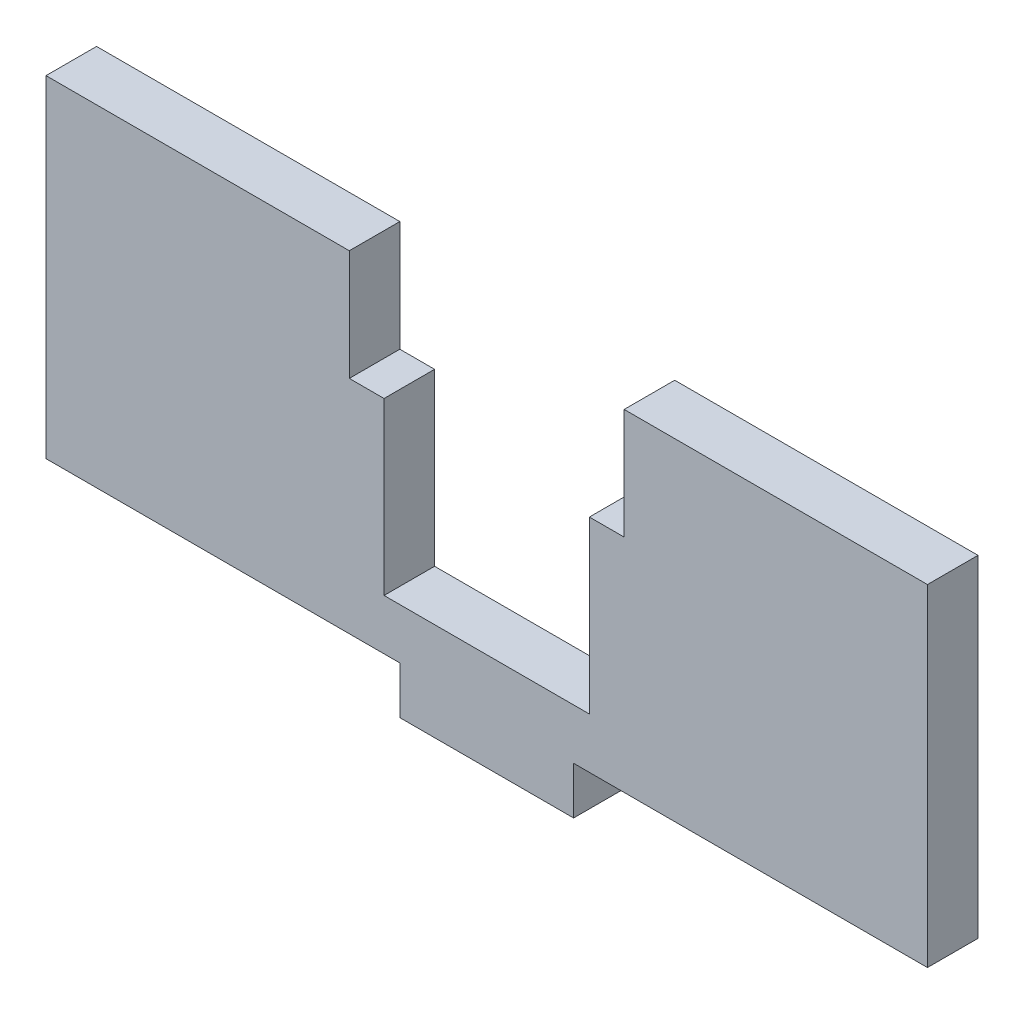
ISO-10303-21;
HEADER;
FILE_DESCRIPTION(('STEP AP214'),'2;1');
FILE_NAME('part.step','',(''),(''),'','','');
FILE_SCHEMA(('AUTOMOTIVE_DESIGN { 1 0 10303 214 1 1 1 1 }'));
ENDSEC;
DATA;
#1=APPLICATION_CONTEXT('core data for automotive mechanical design processes');
#2=APPLICATION_PROTOCOL_DEFINITION('international standard','automotive_design',2000,#1);
#3=PRODUCT_CONTEXT('',#1,'mechanical');
#4=PRODUCT('Part','Part','',(#3));
#5=PRODUCT_RELATED_PRODUCT_CATEGORY('part','',(#4));
#6=PRODUCT_DEFINITION_FORMATION('','',#4);
#7=PRODUCT_DEFINITION_CONTEXT('part definition',#1,'design');
#8=PRODUCT_DEFINITION('design','',#6,#7);
#9=PRODUCT_DEFINITION_SHAPE('','',#8);
#10=(LENGTH_UNIT() NAMED_UNIT(*) SI_UNIT(.MILLI.,.METRE.));
#11=(NAMED_UNIT(*) PLANE_ANGLE_UNIT() SI_UNIT($,.RADIAN.));
#12=(NAMED_UNIT(*) SI_UNIT($,.STERADIAN.) SOLID_ANGLE_UNIT());
#13=UNCERTAINTY_MEASURE_WITH_UNIT(LENGTH_MEASURE(1.E-05),#10,'distance_accuracy_value','');
#14=(GEOMETRIC_REPRESENTATION_CONTEXT(3) GLOBAL_UNCERTAINTY_ASSIGNED_CONTEXT((#13)) GLOBAL_UNIT_ASSIGNED_CONTEXT((#10,
#11,#12)) REPRESENTATION_CONTEXT('',''));
#15=CARTESIAN_POINT('',(0.,0.,0.));
#16=DIRECTION('',(0.,0.,1.));
#17=DIRECTION('',(1.,0.,0.));
#18=AXIS2_PLACEMENT_3D('',#15,#16,#17);
#19=CARTESIAN_POINT('',(-2.75,0.,1.6));
#20=DIRECTION('',(1.,0.,0.));
#21=DIRECTION('',(0.,0.,-1.));
#22=AXIS2_PLACEMENT_3D('',#19,#20,#21);
#23=PLANE('',#22);
#24=DIRECTION('',(0.,-1.,0.));
#25=VECTOR('',#24,1.);
#26=CARTESIAN_POINT('',(-2.75,0.,0.));
#27=LINE('',#26,#25);
#28=CARTESIAN_POINT('',(-2.75,1.5,0.));
#29=VERTEX_POINT('',#28);
#30=CARTESIAN_POINT('',(-2.75,0.,0.));
#31=VERTEX_POINT('',#30);
#32=EDGE_CURVE('E203',#29,#31,#27,.T.);
#33=ORIENTED_EDGE('',*,*,#32,.T.);
#34=DIRECTION('',(0.,0.,-1.));
#35=VECTOR('',#34,1.);
#36=CARTESIAN_POINT('',(-2.75,0.,1.6));
#37=LINE('',#36,#35);
#38=CARTESIAN_POINT('',(-2.75,0.,1.6));
#39=VERTEX_POINT('',#38);
#40=EDGE_CURVE('E40',#39,#31,#37,.T.);
#41=ORIENTED_EDGE('',*,*,#40,.F.);
#42=DIRECTION('',(0.,-1.,0.));
#43=VECTOR('',#42,1.);
#44=CARTESIAN_POINT('',(-2.75,0.,1.6));
#45=LINE('',#44,#43);
#46=CARTESIAN_POINT('',(-2.75,1.5,1.6));
#47=VERTEX_POINT('',#46);
#48=EDGE_CURVE('E204',#47,#39,#45,.T.);
#49=ORIENTED_EDGE('',*,*,#48,.F.);
#50=DIRECTION('',(0.,0.,-1.));
#51=VECTOR('',#50,1.);
#52=CARTESIAN_POINT('',(-2.75,1.5,1.6));
#53=LINE('',#52,#51);
#54=EDGE_CURVE('E227',#47,#29,#53,.T.);
#55=ORIENTED_EDGE('',*,*,#54,.T.);
#56=EDGE_LOOP('',(#33,#41,#49,#55));
#57=FACE_BOUND('',#56,.T.);
#58=ADVANCED_FACE('F33',(#57),#23,.F.);
#59=CARTESIAN_POINT('',(2.75,0.,1.6));
#60=DIRECTION('',(0.,1.,0.));
#61=DIRECTION('',(0.,0.,1.));
#62=AXIS2_PLACEMENT_3D('',#59,#60,#61);
#63=PLANE('',#62);
#64=DIRECTION('',(1.,0.,0.));
#65=VECTOR('',#64,1.);
#66=CARTESIAN_POINT('',(2.75,0.,0.));
#67=LINE('',#66,#65);
#68=CARTESIAN_POINT('',(2.75,0.,0.));
#69=VERTEX_POINT('',#68);
#70=EDGE_CURVE('E230',#31,#69,#67,.T.);
#71=ORIENTED_EDGE('',*,*,#70,.T.);
#72=DIRECTION('',(0.,0.,-1.));
#73=VECTOR('',#72,1.);
#74=CARTESIAN_POINT('',(2.75,0.,1.6));
#75=LINE('',#74,#73);
#76=CARTESIAN_POINT('',(2.75,0.,1.6));
#77=VERTEX_POINT('',#76);
#78=EDGE_CURVE('E266',#77,#69,#75,.T.);
#79=ORIENTED_EDGE('',*,*,#78,.F.);
#80=DIRECTION('',(1.,0.,0.));
#81=VECTOR('',#80,1.);
#82=CARTESIAN_POINT('',(2.75,0.,1.6));
#83=LINE('',#82,#81);
#84=EDGE_CURVE('E207',#39,#77,#83,.T.);
#85=ORIENTED_EDGE('',*,*,#84,.F.);
#86=ORIENTED_EDGE('',*,*,#40,.T.);
#87=EDGE_LOOP('',(#71,#79,#85,#86));
#88=FACE_BOUND('',#87,.T.);
#89=ADVANCED_FACE('F271',(#88),#63,.F.);
#90=CARTESIAN_POINT('',(2.75,0.,1.6));
#91=DIRECTION('',(-1.,0.,0.));
#92=DIRECTION('',(0.,0.,1.));
#93=AXIS2_PLACEMENT_3D('',#90,#91,#92);
#94=PLANE('',#93);
#95=DIRECTION('',(0.,1.,0.));
#96=VECTOR('',#95,1.);
#97=CARTESIAN_POINT('',(2.75,0.,0.));
#98=LINE('',#97,#96);
#99=CARTESIAN_POINT('',(2.75,1.5,0.));
#100=VERTEX_POINT('',#99);
#101=EDGE_CURVE('E232',#69,#100,#98,.T.);
#102=ORIENTED_EDGE('',*,*,#101,.T.);
#103=DIRECTION('',(0.,0.,-1.));
#104=VECTOR('',#103,1.);
#105=CARTESIAN_POINT('',(2.75,1.5,1.6));
#106=LINE('',#105,#104);
#107=CARTESIAN_POINT('',(2.75,1.5,1.6));
#108=VERTEX_POINT('',#107);
#109=EDGE_CURVE('E263',#108,#100,#106,.T.);
#110=ORIENTED_EDGE('',*,*,#109,.F.);
#111=DIRECTION('',(0.,1.,0.));
#112=VECTOR('',#111,1.);
#113=CARTESIAN_POINT('',(2.75,0.,1.6));
#114=LINE('',#113,#112);
#115=EDGE_CURVE('E210',#77,#108,#114,.T.);
#116=ORIENTED_EDGE('',*,*,#115,.F.);
#117=ORIENTED_EDGE('',*,*,#78,.T.);
#118=EDGE_LOOP('',(#102,#110,#116,#117));
#119=FACE_BOUND('',#118,.T.);
#120=ADVANCED_FACE('F284',(#119),#94,.F.);
#121=CARTESIAN_POINT('',(2.75,1.5,1.6));
#122=DIRECTION('',(0.,1.,0.));
#123=DIRECTION('',(-1.,0.,0.));
#124=AXIS2_PLACEMENT_3D('',#121,#122,#123);
#125=PLANE('',#124);
#126=DIRECTION('',(1.,0.,0.));
#127=VECTOR('',#126,1.);
#128=CARTESIAN_POINT('',(2.75,1.5,0.));
#129=LINE('',#128,#127);
#130=CARTESIAN_POINT('',(13.95,1.5,0.));
#131=VERTEX_POINT('',#130);
#132=EDGE_CURVE('E234',#100,#131,#129,.T.);
#133=ORIENTED_EDGE('',*,*,#132,.T.);
#134=DIRECTION('',(0.,0.,-1.));
#135=VECTOR('',#134,1.);
#136=CARTESIAN_POINT('',(13.95,1.5,1.6));
#137=LINE('',#136,#135);
#138=CARTESIAN_POINT('',(13.95,1.5,1.6));
#139=VERTEX_POINT('',#138);
#140=EDGE_CURVE('E261',#139,#131,#137,.T.);
#141=ORIENTED_EDGE('',*,*,#140,.F.);
#142=DIRECTION('',(1.,0.,0.));
#143=VECTOR('',#142,1.);
#144=CARTESIAN_POINT('',(2.75,1.5,1.6));
#145=LINE('',#144,#143);
#146=EDGE_CURVE('E154',#108,#139,#145,.T.);
#147=ORIENTED_EDGE('',*,*,#146,.F.);
#148=ORIENTED_EDGE('',*,*,#109,.T.);
#149=EDGE_LOOP('',(#133,#141,#147,#148));
#150=FACE_BOUND('',#149,.T.);
#151=ADVANCED_FACE('F287',(#150),#125,.F.);
#152=CARTESIAN_POINT('',(13.95,1.5,1.6));
#153=DIRECTION('',(-1.,0.,0.));
#154=DIRECTION('',(0.,0.,1.));
#155=AXIS2_PLACEMENT_3D('',#152,#153,#154);
#156=PLANE('',#155);
#157=DIRECTION('',(0.,1.,0.));
#158=VECTOR('',#157,1.);
#159=CARTESIAN_POINT('',(13.95,1.5,0.));
#160=LINE('',#159,#158);
#161=CARTESIAN_POINT('',(13.95,12.,0.));
#162=VERTEX_POINT('',#161);
#163=EDGE_CURVE('E164',#131,#162,#160,.T.);
#164=ORIENTED_EDGE('',*,*,#163,.T.);
#165=DIRECTION('',(0.,0.,1.));
#166=VECTOR('',#165,1.);
#167=CARTESIAN_POINT('',(13.95,12.,-9.65194280961092));
#168=LINE('',#167,#166);
#169=CARTESIAN_POINT('',(13.95,12.,1.6));
#170=VERTEX_POINT('',#169);
#171=EDGE_CURVE('E161',#162,#170,#168,.T.);
#172=ORIENTED_EDGE('',*,*,#171,.T.);
#173=DIRECTION('',(0.,1.,0.));
#174=VECTOR('',#173,1.);
#175=CARTESIAN_POINT('',(13.95,1.5,1.6));
#176=LINE('',#175,#174);
#177=EDGE_CURVE('E147',#139,#170,#176,.T.);
#178=ORIENTED_EDGE('',*,*,#177,.F.);
#179=ORIENTED_EDGE('',*,*,#140,.T.);
#180=EDGE_LOOP('',(#164,#172,#178,#179));
#181=FACE_BOUND('',#180,.T.);
#182=ADVANCED_FACE('F162',(#181),#156,.F.);
#183=CARTESIAN_POINT('',(4.35,11.,1.6));
#184=DIRECTION('',(1.,0.,0.));
#185=DIRECTION('',(0.,0.,-1.));
#186=AXIS2_PLACEMENT_3D('',#183,#184,#185);
#187=PLANE('',#186);
#188=DIRECTION('',(0.,-1.,0.));
#189=VECTOR('',#188,1.);
#190=CARTESIAN_POINT('',(4.35,11.,0.));
#191=LINE('',#190,#189);
#192=CARTESIAN_POINT('',(4.35,12.,0.));
#193=VERTEX_POINT('',#192);
#194=CARTESIAN_POINT('',(4.35,8.5,0.));
#195=VERTEX_POINT('',#194);
#196=EDGE_CURVE('E47',#193,#195,#191,.T.);
#197=ORIENTED_EDGE('',*,*,#196,.T.);
#198=DIRECTION('',(0.,0.,1.));
#199=VECTOR('',#198,1.);
#200=CARTESIAN_POINT('',(4.35,8.5,0.));
#201=LINE('',#200,#199);
#202=CARTESIAN_POINT('',(4.35,8.5,1.6));
#203=VERTEX_POINT('',#202);
#204=EDGE_CURVE('E195',#195,#203,#201,.T.);
#205=ORIENTED_EDGE('',*,*,#204,.T.);
#206=DIRECTION('',(0.,-1.,0.));
#207=VECTOR('',#206,1.);
#208=CARTESIAN_POINT('',(4.35,11.,1.6));
#209=LINE('',#208,#207);
#210=CARTESIAN_POINT('',(4.35,12.,1.6));
#211=VERTEX_POINT('',#210);
#212=EDGE_CURVE('E158',#211,#203,#209,.T.);
#213=ORIENTED_EDGE('',*,*,#212,.F.);
#214=DIRECTION('',(0.,0.,1.));
#215=VECTOR('',#214,1.);
#216=CARTESIAN_POINT('',(4.35,12.,-9.65194280961092));
#217=LINE('',#216,#215);
#218=EDGE_CURVE('E168',#193,#211,#217,.T.);
#219=ORIENTED_EDGE('',*,*,#218,.F.);
#220=EDGE_LOOP('',(#197,#205,#213,#219));
#221=FACE_BOUND('',#220,.T.);
#222=ADVANCED_FACE('F289',(#221),#187,.F.);
#223=CARTESIAN_POINT('',(3.25,9.5,1.6));
#224=DIRECTION('',(1.,0.,0.));
#225=DIRECTION('',(0.,1.,0.));
#226=AXIS2_PLACEMENT_3D('',#223,#224,#225);
#227=PLANE('',#226);
#228=DIRECTION('',(0.,-1.,0.));
#229=VECTOR('',#228,1.);
#230=CARTESIAN_POINT('',(3.25,9.5,1.6));
#231=LINE('',#230,#229);
#232=CARTESIAN_POINT('',(3.25,8.5,1.6));
#233=VERTEX_POINT('',#232);
#234=CARTESIAN_POINT('',(3.25,3.1,1.6));
#235=VERTEX_POINT('',#234);
#236=EDGE_CURVE('E214',#233,#235,#231,.T.);
#237=ORIENTED_EDGE('',*,*,#236,.F.);
#238=DIRECTION('',(0.,0.,-1.));
#239=VECTOR('',#238,1.);
#240=CARTESIAN_POINT('',(3.25,8.5,1.6));
#241=LINE('',#240,#239);
#242=CARTESIAN_POINT('',(3.25,8.5,0.));
#243=VERTEX_POINT('',#242);
#244=EDGE_CURVE('E200',#233,#243,#241,.T.);
#245=ORIENTED_EDGE('',*,*,#244,.T.);
#246=DIRECTION('',(0.,-1.,0.));
#247=VECTOR('',#246,1.);
#248=CARTESIAN_POINT('',(3.25,9.5,0.));
#249=LINE('',#248,#247);
#250=CARTESIAN_POINT('',(3.25,3.1,0.));
#251=VERTEX_POINT('',#250);
#252=EDGE_CURVE('E238',#243,#251,#249,.T.);
#253=ORIENTED_EDGE('',*,*,#252,.T.);
#254=DIRECTION('',(0.,0.,-1.));
#255=VECTOR('',#254,1.);
#256=CARTESIAN_POINT('',(3.25,3.1,1.6));
#257=LINE('',#256,#255);
#258=EDGE_CURVE('E258',#235,#251,#257,.T.);
#259=ORIENTED_EDGE('',*,*,#258,.F.);
#260=EDGE_LOOP('',(#237,#245,#253,#259));
#261=FACE_BOUND('',#260,.T.);
#262=ADVANCED_FACE('F296',(#261),#227,.F.);
#263=CARTESIAN_POINT('',(-3.25,3.1,1.6));
#264=DIRECTION('',(0.,-1.,0.));
#265=DIRECTION('',(0.,0.,-1.));
#266=AXIS2_PLACEMENT_3D('',#263,#264,#265);
#267=PLANE('',#266);
#268=DIRECTION('',(-1.,0.,0.));
#269=VECTOR('',#268,1.);
#270=CARTESIAN_POINT('',(-3.25,3.1,0.));
#271=LINE('',#270,#269);
#272=CARTESIAN_POINT('',(-3.25,3.1,0.));
#273=VERTEX_POINT('',#272);
#274=EDGE_CURVE('E240',#251,#273,#271,.T.);
#275=ORIENTED_EDGE('',*,*,#274,.T.);
#276=DIRECTION('',(0.,0.,-1.));
#277=VECTOR('',#276,1.);
#278=CARTESIAN_POINT('',(-3.25,3.1,1.6));
#279=LINE('',#278,#277);
#280=CARTESIAN_POINT('',(-3.25,3.1,1.6));
#281=VERTEX_POINT('',#280);
#282=EDGE_CURVE('E255',#281,#273,#279,.T.);
#283=ORIENTED_EDGE('',*,*,#282,.F.);
#284=DIRECTION('',(-1.,0.,0.));
#285=VECTOR('',#284,1.);
#286=CARTESIAN_POINT('',(-3.25,3.1,1.6));
#287=LINE('',#286,#285);
#288=EDGE_CURVE('E216',#235,#281,#287,.T.);
#289=ORIENTED_EDGE('',*,*,#288,.F.);
#290=ORIENTED_EDGE('',*,*,#258,.T.);
#291=EDGE_LOOP('',(#275,#283,#289,#290));
#292=FACE_BOUND('',#291,.T.);
#293=ADVANCED_FACE('F302',(#292),#267,.F.);
#294=CARTESIAN_POINT('',(-3.25,9.5,1.6));
#295=DIRECTION('',(-1.,0.,0.));
#296=DIRECTION('',(0.,-1.,0.));
#297=AXIS2_PLACEMENT_3D('',#294,#295,#296);
#298=PLANE('',#297);
#299=DIRECTION('',(0.,1.,0.));
#300=VECTOR('',#299,1.);
#301=CARTESIAN_POINT('',(-3.25,9.5,0.));
#302=LINE('',#301,#300);
#303=CARTESIAN_POINT('',(-3.25,8.5,0.));
#304=VERTEX_POINT('',#303);
#305=EDGE_CURVE('E242',#273,#304,#302,.T.);
#306=ORIENTED_EDGE('',*,*,#305,.T.);
#307=DIRECTION('',(0.,0.,1.));
#308=VECTOR('',#307,1.);
#309=CARTESIAN_POINT('',(-3.25,8.5,1.6));
#310=LINE('',#309,#308);
#311=CARTESIAN_POINT('',(-3.25,8.5,1.6));
#312=VERTEX_POINT('',#311);
#313=EDGE_CURVE('E55',#304,#312,#310,.T.);
#314=ORIENTED_EDGE('',*,*,#313,.T.);
#315=DIRECTION('',(0.,1.,0.));
#316=VECTOR('',#315,1.);
#317=CARTESIAN_POINT('',(-3.25,9.5,1.6));
#318=LINE('',#317,#316);
#319=EDGE_CURVE('E218',#281,#312,#318,.T.);
#320=ORIENTED_EDGE('',*,*,#319,.F.);
#321=ORIENTED_EDGE('',*,*,#282,.T.);
#322=EDGE_LOOP('',(#306,#314,#320,#321));
#323=FACE_BOUND('',#322,.T.);
#324=ADVANCED_FACE('F306',(#323),#298,.F.);
#325=CARTESIAN_POINT('',(-4.35,11.,1.6));
#326=DIRECTION('',(-1.,0.,0.));
#327=DIRECTION('',(0.,0.,1.));
#328=AXIS2_PLACEMENT_3D('',#325,#326,#327);
#329=PLANE('',#328);
#330=DIRECTION('',(0.,1.,0.));
#331=VECTOR('',#330,1.);
#332=CARTESIAN_POINT('',(-4.35,11.,0.));
#333=LINE('',#332,#331);
#334=CARTESIAN_POINT('',(-4.35,8.5,0.));
#335=VERTEX_POINT('',#334);
#336=CARTESIAN_POINT('',(-4.35,12.,0.));
#337=VERTEX_POINT('',#336);
#338=EDGE_CURVE('E245',#335,#337,#333,.T.);
#339=ORIENTED_EDGE('',*,*,#338,.T.);
#340=DIRECTION('',(0.,0.,1.));
#341=VECTOR('',#340,1.);
#342=CARTESIAN_POINT('',(-4.35,12.,-9.65194280961092));
#343=LINE('',#342,#341);
#344=CARTESIAN_POINT('',(-4.35,12.,1.6));
#345=VERTEX_POINT('',#344);
#346=EDGE_CURVE('E185',#337,#345,#343,.T.);
#347=ORIENTED_EDGE('',*,*,#346,.T.);
#348=DIRECTION('',(0.,1.,0.));
#349=VECTOR('',#348,1.);
#350=CARTESIAN_POINT('',(-4.35,11.,1.6));
#351=LINE('',#350,#349);
#352=CARTESIAN_POINT('',(-4.35,8.5,1.6));
#353=VERTEX_POINT('',#352);
#354=EDGE_CURVE('E221',#353,#345,#351,.T.);
#355=ORIENTED_EDGE('',*,*,#354,.F.);
#356=DIRECTION('',(0.,0.,1.));
#357=VECTOR('',#356,1.);
#358=CARTESIAN_POINT('',(-4.35,8.5,0.));
#359=LINE('',#358,#357);
#360=EDGE_CURVE('E192',#335,#353,#359,.T.);
#361=ORIENTED_EDGE('',*,*,#360,.F.);
#362=EDGE_LOOP('',(#339,#347,#355,#361));
#363=FACE_BOUND('',#362,.T.);
#364=ADVANCED_FACE('F310',(#363),#329,.F.);
#365=CARTESIAN_POINT('',(-13.95,1.5,1.6));
#366=DIRECTION('',(1.,0.,0.));
#367=DIRECTION('',(0.,0.,-1.));
#368=AXIS2_PLACEMENT_3D('',#365,#366,#367);
#369=PLANE('',#368);
#370=DIRECTION('',(0.,-1.,0.));
#371=VECTOR('',#370,1.);
#372=CARTESIAN_POINT('',(-13.95,1.5,0.));
#373=LINE('',#372,#371);
#374=CARTESIAN_POINT('',(-13.95,12.,0.));
#375=VERTEX_POINT('',#374);
#376=CARTESIAN_POINT('',(-13.95,1.5,0.));
#377=VERTEX_POINT('',#376);
#378=EDGE_CURVE('E247',#375,#377,#373,.T.);
#379=ORIENTED_EDGE('',*,*,#378,.T.);
#380=DIRECTION('',(0.,0.,-1.));
#381=VECTOR('',#380,1.);
#382=CARTESIAN_POINT('',(-13.95,1.5,1.6));
#383=LINE('',#382,#381);
#384=CARTESIAN_POINT('',(-13.95,1.5,1.6));
#385=VERTEX_POINT('',#384);
#386=EDGE_CURVE('E252',#385,#377,#383,.T.);
#387=ORIENTED_EDGE('',*,*,#386,.F.);
#388=DIRECTION('',(0.,-1.,0.));
#389=VECTOR('',#388,1.);
#390=CARTESIAN_POINT('',(-13.95,1.5,1.6));
#391=LINE('',#390,#389);
#392=CARTESIAN_POINT('',(-13.95,12.,1.6));
#393=VERTEX_POINT('',#392);
#394=EDGE_CURVE('E223',#393,#385,#391,.T.);
#395=ORIENTED_EDGE('',*,*,#394,.F.);
#396=DIRECTION('',(0.,0.,1.));
#397=VECTOR('',#396,1.);
#398=CARTESIAN_POINT('',(-13.95,12.,-9.65194280961092));
#399=LINE('',#398,#397);
#400=EDGE_CURVE('E182',#375,#393,#399,.T.);
#401=ORIENTED_EDGE('',*,*,#400,.F.);
#402=EDGE_LOOP('',(#379,#387,#395,#401));
#403=FACE_BOUND('',#402,.T.);
#404=ADVANCED_FACE('F320',(#403),#369,.F.);
#405=CARTESIAN_POINT('',(-2.75,1.5,1.6));
#406=DIRECTION('',(0.,1.,0.));
#407=DIRECTION('',(-1.,0.,0.));
#408=AXIS2_PLACEMENT_3D('',#405,#406,#407);
#409=PLANE('',#408);
#410=DIRECTION('',(1.,0.,0.));
#411=VECTOR('',#410,1.);
#412=CARTESIAN_POINT('',(-2.75,1.5,0.));
#413=LINE('',#412,#411);
#414=EDGE_CURVE('E208',#377,#29,#413,.T.);
#415=ORIENTED_EDGE('',*,*,#414,.T.);
#416=ORIENTED_EDGE('',*,*,#54,.F.);
#417=DIRECTION('',(1.,0.,0.));
#418=VECTOR('',#417,1.);
#419=CARTESIAN_POINT('',(-2.75,1.5,1.6));
#420=LINE('',#419,#418);
#421=EDGE_CURVE('E225',#385,#47,#420,.T.);
#422=ORIENTED_EDGE('',*,*,#421,.F.);
#423=ORIENTED_EDGE('',*,*,#386,.T.);
#424=EDGE_LOOP('',(#415,#416,#422,#423));
#425=FACE_BOUND('',#424,.T.);
#426=ADVANCED_FACE('F322',(#425),#409,.F.);
#427=CARTESIAN_POINT('',(0.,0.,1.6));
#428=DIRECTION('',(0.,0.,1.));
#429=DIRECTION('',(1.,0.,0.));
#430=AXIS2_PLACEMENT_3D('',#427,#428,#429);
#431=PLANE('',#430);
#432=DIRECTION('',(1.,0.,0.));
#433=VECTOR('',#432,1.);
#434=CARTESIAN_POINT('',(-4.35,8.5,1.6));
#435=LINE('',#434,#433);
#436=EDGE_CURVE('E193',#353,#312,#435,.T.);
#437=ORIENTED_EDGE('',*,*,#436,.F.);
#438=ORIENTED_EDGE('',*,*,#354,.T.);
#439=DIRECTION('',(-1.,0.,0.));
#440=VECTOR('',#439,1.);
#441=CARTESIAN_POINT('',(-13.95,12.,1.6));
#442=LINE('',#441,#440);
#443=EDGE_CURVE('E177',#345,#393,#442,.T.);
#444=ORIENTED_EDGE('',*,*,#443,.T.);
#445=ORIENTED_EDGE('',*,*,#394,.T.);
#446=ORIENTED_EDGE('',*,*,#421,.T.);
#447=ORIENTED_EDGE('',*,*,#48,.T.);
#448=ORIENTED_EDGE('',*,*,#84,.T.);
#449=ORIENTED_EDGE('',*,*,#115,.T.);
#450=ORIENTED_EDGE('',*,*,#146,.T.);
#451=ORIENTED_EDGE('',*,*,#177,.T.);
#452=DIRECTION('',(-1.,0.,0.));
#453=VECTOR('',#452,1.);
#454=CARTESIAN_POINT('',(13.95,12.,1.6));
#455=LINE('',#454,#453);
#456=EDGE_CURVE('E152',#170,#211,#455,.T.);
#457=ORIENTED_EDGE('',*,*,#456,.T.);
#458=ORIENTED_EDGE('',*,*,#212,.T.);
#459=EDGE_CURVE('E181',#233,#203,#435,.T.);
#460=ORIENTED_EDGE('',*,*,#459,.F.);
#461=ORIENTED_EDGE('',*,*,#236,.T.);
#462=ORIENTED_EDGE('',*,*,#288,.T.);
#463=ORIENTED_EDGE('',*,*,#319,.T.);
#464=EDGE_LOOP('',(#437,#438,#444,#445,#446,#447,#448,#449,#450,#451,#457,#458,#460,#461,#462,#463));
#465=FACE_BOUND('',#464,.T.);
#466=ADVANCED_FACE('F150',(#465),#431,.T.);
#467=CARTESIAN_POINT('',(0.,0.,0.));
#468=DIRECTION('',(0.,0.,1.));
#469=DIRECTION('',(1.,0.,0.));
#470=AXIS2_PLACEMENT_3D('',#467,#468,#469);
#471=PLANE('',#470);
#472=ORIENTED_EDGE('',*,*,#338,.F.);
#473=DIRECTION('',(1.,0.,0.));
#474=VECTOR('',#473,1.);
#475=CARTESIAN_POINT('',(-4.35,8.5,0.));
#476=LINE('',#475,#474);
#477=EDGE_CURVE('E190',#335,#304,#476,.T.);
#478=ORIENTED_EDGE('',*,*,#477,.T.);
#479=ORIENTED_EDGE('',*,*,#305,.F.);
#480=ORIENTED_EDGE('',*,*,#274,.F.);
#481=ORIENTED_EDGE('',*,*,#252,.F.);
#482=DIRECTION('',(1.,0.,0.));
#483=VECTOR('',#482,1.);
#484=CARTESIAN_POINT('',(0.,8.5,0.));
#485=LINE('',#484,#483);
#486=EDGE_CURVE('E11',#243,#195,#485,.T.);
#487=ORIENTED_EDGE('',*,*,#486,.T.);
#488=ORIENTED_EDGE('',*,*,#196,.F.);
#489=DIRECTION('',(1.,0.,0.));
#490=VECTOR('',#489,1.);
#491=CARTESIAN_POINT('',(13.95,12.,0.));
#492=LINE('',#491,#490);
#493=EDGE_CURVE('E174',#193,#162,#492,.T.);
#494=ORIENTED_EDGE('',*,*,#493,.T.);
#495=ORIENTED_EDGE('',*,*,#163,.F.);
#496=ORIENTED_EDGE('',*,*,#132,.F.);
#497=ORIENTED_EDGE('',*,*,#101,.F.);
#498=ORIENTED_EDGE('',*,*,#70,.F.);
#499=ORIENTED_EDGE('',*,*,#32,.F.);
#500=ORIENTED_EDGE('',*,*,#414,.F.);
#501=ORIENTED_EDGE('',*,*,#378,.F.);
#502=DIRECTION('',(1.,0.,0.));
#503=VECTOR('',#502,1.);
#504=CARTESIAN_POINT('',(-13.95,12.,0.));
#505=LINE('',#504,#503);
#506=EDGE_CURVE('E178',#375,#337,#505,.T.);
#507=ORIENTED_EDGE('',*,*,#506,.T.);
#508=EDGE_LOOP('',(#472,#478,#479,#480,#481,#487,#488,#494,#495,#496,#497,#498,#499,#500,#501,#507));
#509=FACE_BOUND('',#508,.T.);
#510=ADVANCED_FACE('F279',(#509),#471,.F.);
#511=CARTESIAN_POINT('',(-4.35,8.5,0.));
#512=DIRECTION('',(0.,-1.,0.));
#513=DIRECTION('',(0.,0.,-1.));
#514=AXIS2_PLACEMENT_3D('',#511,#512,#513);
#515=PLANE('',#514);
#516=ORIENTED_EDGE('',*,*,#459,.T.);
#517=ORIENTED_EDGE('',*,*,#204,.F.);
#518=ORIENTED_EDGE('',*,*,#486,.F.);
#519=ORIENTED_EDGE('',*,*,#244,.F.);
#520=EDGE_LOOP('',(#516,#517,#518,#519));
#521=FACE_BOUND('',#520,.T.);
#522=ADVANCED_FACE('F294',(#521),#515,.F.);
#523=ORIENTED_EDGE('',*,*,#477,.F.);
#524=ORIENTED_EDGE('',*,*,#360,.T.);
#525=ORIENTED_EDGE('',*,*,#436,.T.);
#526=ORIENTED_EDGE('',*,*,#313,.F.);
#527=EDGE_LOOP('',(#523,#524,#525,#526));
#528=FACE_BOUND('',#527,.T.);
#529=ADVANCED_FACE('F307',(#528),#515,.F.);
#530=CARTESIAN_POINT('',(-13.95,12.,-9.65194280961092));
#531=DIRECTION('',(0.,1.,0.));
#532=DIRECTION('',(0.,0.,1.));
#533=AXIS2_PLACEMENT_3D('',#530,#531,#532);
#534=PLANE('',#533);
#535=ORIENTED_EDGE('',*,*,#506,.F.);
#536=ORIENTED_EDGE('',*,*,#400,.T.);
#537=ORIENTED_EDGE('',*,*,#443,.F.);
#538=ORIENTED_EDGE('',*,*,#346,.F.);
#539=EDGE_LOOP('',(#535,#536,#537,#538));
#540=FACE_BOUND('',#539,.T.);
#541=ADVANCED_FACE('F315',(#540),#534,.T.);
#542=CARTESIAN_POINT('',(13.95,12.,-9.65194280961092));
#543=DIRECTION('',(0.,1.,0.));
#544=DIRECTION('',(-1.,0.,0.));
#545=AXIS2_PLACEMENT_3D('',#542,#543,#544);
#546=PLANE('',#545);
#547=ORIENTED_EDGE('',*,*,#493,.F.);
#548=ORIENTED_EDGE('',*,*,#218,.T.);
#549=ORIENTED_EDGE('',*,*,#456,.F.);
#550=ORIENTED_EDGE('',*,*,#171,.F.);
#551=EDGE_LOOP('',(#547,#548,#549,#550));
#552=FACE_BOUND('',#551,.T.);
#553=ADVANCED_FACE('F171',(#552),#546,.T.);
#554=CLOSED_SHELL('',(#58,#89,#120,#151,#182,#222,#262,#293,#324,#364,#404,#426,#466,#510,#522,
#529,#541,#553));
#555=MANIFOLD_SOLID_BREP('B2',#554);
#556=ADVANCED_BREP_SHAPE_REPRESENTATION('',(#18,#555),#14);
#557=SHAPE_DEFINITION_REPRESENTATION(#9,#556);
ENDSEC;
END-ISO-10303-21;
